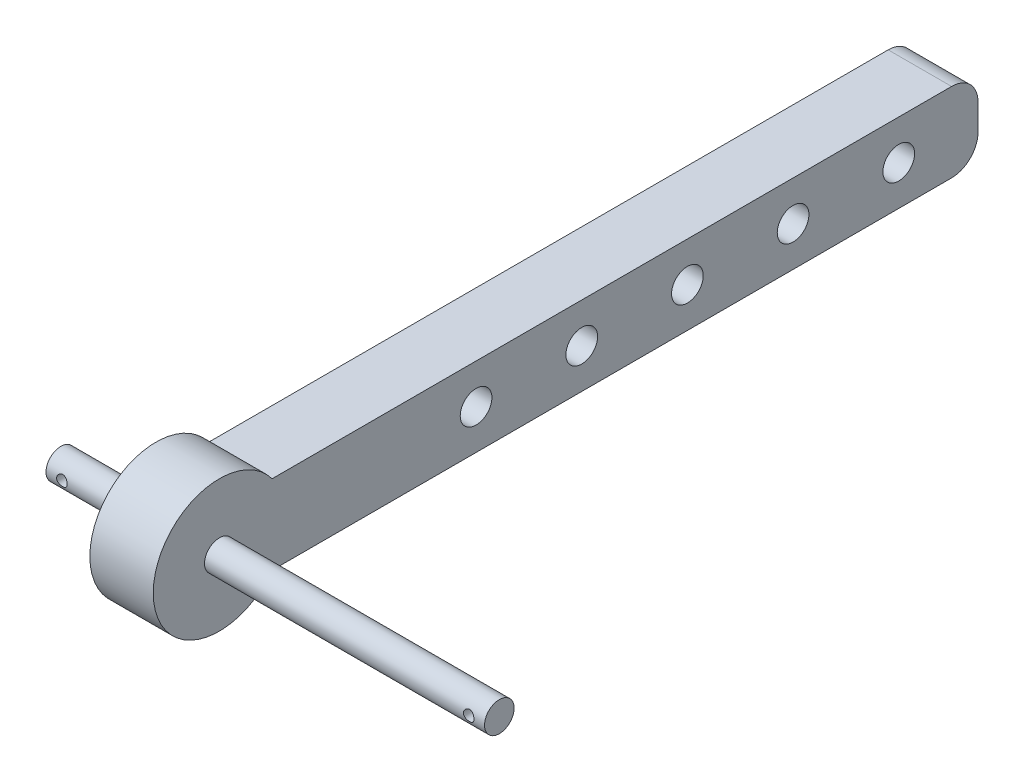
ISO-10303-21;
HEADER;
FILE_DESCRIPTION(('STEP AP214'),'2;1');
FILE_NAME('part.step','',(''),(''),'','','');
FILE_SCHEMA(('AUTOMOTIVE_DESIGN { 1 0 10303 214 1 1 1 1 }'));
ENDSEC;
DATA;
#1=APPLICATION_CONTEXT('core data for automotive mechanical design processes');
#2=APPLICATION_PROTOCOL_DEFINITION('international standard','automotive_design',2000,#1);
#3=PRODUCT_CONTEXT('',#1,'mechanical');
#4=PRODUCT('Part','Part','',(#3));
#5=PRODUCT_RELATED_PRODUCT_CATEGORY('part','',(#4));
#6=PRODUCT_DEFINITION_FORMATION('','',#4);
#7=PRODUCT_DEFINITION_CONTEXT('part definition',#1,'design');
#8=PRODUCT_DEFINITION('design','',#6,#7);
#9=PRODUCT_DEFINITION_SHAPE('','',#8);
#10=(LENGTH_UNIT() NAMED_UNIT(*) SI_UNIT(.MILLI.,.METRE.));
#11=(NAMED_UNIT(*) PLANE_ANGLE_UNIT() SI_UNIT($,.RADIAN.));
#12=(NAMED_UNIT(*) SI_UNIT($,.STERADIAN.) SOLID_ANGLE_UNIT());
#13=UNCERTAINTY_MEASURE_WITH_UNIT(LENGTH_MEASURE(1.E-05),#10,'distance_accuracy_value','');
#14=(GEOMETRIC_REPRESENTATION_CONTEXT(3) GLOBAL_UNCERTAINTY_ASSIGNED_CONTEXT((#13)) GLOBAL_UNIT_ASSIGNED_CONTEXT((#10,
#11,#12)) REPRESENTATION_CONTEXT('',''));
#15=CARTESIAN_POINT('',(0.,0.,0.));
#16=DIRECTION('',(0.,0.,1.));
#17=DIRECTION('',(1.,0.,0.));
#18=AXIS2_PLACEMENT_3D('',#15,#16,#17);
#19=CARTESIAN_POINT('',(12.,0.,0.));
#20=DIRECTION('',(0.,1.,0.));
#21=DIRECTION('',(0.,0.,1.));
#22=AXIS2_PLACEMENT_3D('',#19,#20,#21);
#23=PLANE('',#22);
#24=DIRECTION('',(0.,0.,-1.));
#25=VECTOR('',#24,1.);
#26=CARTESIAN_POINT('',(12.,0.,0.));
#27=LINE('',#26,#25);
#28=CARTESIAN_POINT('',(12.,0.,-16.4));
#29=VERTEX_POINT('',#28);
#30=CARTESIAN_POINT('',(12.,0.,-145.));
#31=VERTEX_POINT('',#30);
#32=EDGE_CURVE('E59',#29,#31,#27,.T.);
#33=ORIENTED_EDGE('',*,*,#32,.F.);
#34=DIRECTION('',(1.,0.,0.));
#35=VECTOR('',#34,1.);
#36=CARTESIAN_POINT('',(-35.3553390593274,0.,-16.4));
#37=LINE('',#36,#35);
#38=CARTESIAN_POINT('',(0.,0.,-16.4));
#39=VERTEX_POINT('',#38);
#40=EDGE_CURVE('E96',#29,#39,#37,.F.);
#41=ORIENTED_EDGE('',*,*,#40,.T.);
#42=DIRECTION('',(0.,0.,-1.));
#43=VECTOR('',#42,1.);
#44=CARTESIAN_POINT('',(0.,0.,0.));
#45=LINE('',#44,#43);
#46=CARTESIAN_POINT('',(0.,0.,-145.));
#47=VERTEX_POINT('',#46);
#48=EDGE_CURVE('E118',#39,#47,#45,.T.);
#49=ORIENTED_EDGE('',*,*,#48,.T.);
#50=DIRECTION('',(-1.,0.,0.));
#51=VECTOR('',#50,1.);
#52=CARTESIAN_POINT('',(12.,0.,-145.));
#53=LINE('',#52,#51);
#54=EDGE_CURVE('E131',#47,#31,#53,.F.);
#55=ORIENTED_EDGE('',*,*,#54,.T.);
#56=EDGE_LOOP('',(#33,#41,#49,#55));
#57=FACE_BOUND('',#56,.T.);
#58=ADVANCED_FACE('F37',(#57),#23,.F.);
#59=CARTESIAN_POINT('',(12.,0.,-150.));
#60=DIRECTION('',(0.,0.,1.));
#61=DIRECTION('',(1.,0.,0.));
#62=AXIS2_PLACEMENT_3D('',#59,#60,#61);
#63=PLANE('',#62);
#64=DIRECTION('',(0.,1.,0.));
#65=VECTOR('',#64,1.);
#66=CARTESIAN_POINT('',(12.,0.,-150.));
#67=LINE('',#66,#65);
#68=CARTESIAN_POINT('',(12.,5.,-150.));
#69=VERTEX_POINT('',#68);
#70=CARTESIAN_POINT('',(12.,10.,-150.));
#71=VERTEX_POINT('',#70);
#72=EDGE_CURVE('E111',#69,#71,#67,.T.);
#73=ORIENTED_EDGE('',*,*,#72,.F.);
#74=DIRECTION('',(-1.,0.,0.));
#75=VECTOR('',#74,1.);
#76=CARTESIAN_POINT('',(12.,5.,-150.));
#77=LINE('',#76,#75);
#78=CARTESIAN_POINT('',(0.,5.,-150.));
#79=VERTEX_POINT('',#78);
#80=EDGE_CURVE('E113',#69,#79,#77,.T.);
#81=ORIENTED_EDGE('',*,*,#80,.T.);
#82=DIRECTION('',(0.,1.,0.));
#83=VECTOR('',#82,1.);
#84=CARTESIAN_POINT('',(0.,0.,-150.));
#85=LINE('',#84,#83);
#86=CARTESIAN_POINT('',(0.,10.,-150.));
#87=VERTEX_POINT('',#86);
#88=EDGE_CURVE('E120',#79,#87,#85,.T.);
#89=ORIENTED_EDGE('',*,*,#88,.T.);
#90=DIRECTION('',(-1.,0.,0.));
#91=VECTOR('',#90,1.);
#92=CARTESIAN_POINT('',(12.,10.,-150.));
#93=LINE('',#92,#91);
#94=EDGE_CURVE('E110',#87,#71,#93,.F.);
#95=ORIENTED_EDGE('',*,*,#94,.T.);
#96=EDGE_LOOP('',(#73,#81,#89,#95));
#97=FACE_BOUND('',#96,.T.);
#98=ADVANCED_FACE('F151',(#97),#63,.F.);
#99=CARTESIAN_POINT('',(12.,15.,0.));
#100=DIRECTION('',(0.,-1.,0.));
#101=DIRECTION('',(0.,0.,-1.));
#102=AXIS2_PLACEMENT_3D('',#99,#100,#101);
#103=PLANE('',#102);
#104=DIRECTION('',(0.,0.,1.));
#105=VECTOR('',#104,1.);
#106=CARTESIAN_POINT('',(0.,15.,0.));
#107=LINE('',#106,#105);
#108=CARTESIAN_POINT('',(0.,15.,-145.));
#109=VERTEX_POINT('',#108);
#110=CARTESIAN_POINT('',(0.,15.,-16.4));
#111=VERTEX_POINT('',#110);
#112=EDGE_CURVE('E107',#109,#111,#107,.T.);
#113=ORIENTED_EDGE('',*,*,#112,.T.);
#114=DIRECTION('',(1.,0.,0.));
#115=VECTOR('',#114,1.);
#116=CARTESIAN_POINT('',(-35.3553390593274,15.,-16.4));
#117=LINE('',#116,#115);
#118=CARTESIAN_POINT('',(12.,15.,-16.4));
#119=VERTEX_POINT('',#118);
#120=EDGE_CURVE('E93',#111,#119,#117,.T.);
#121=ORIENTED_EDGE('',*,*,#120,.T.);
#122=DIRECTION('',(0.,0.,1.));
#123=VECTOR('',#122,1.);
#124=CARTESIAN_POINT('',(12.,15.,0.));
#125=LINE('',#124,#123);
#126=CARTESIAN_POINT('',(12.,15.,-145.));
#127=VERTEX_POINT('',#126);
#128=EDGE_CURVE('E104',#127,#119,#125,.T.);
#129=ORIENTED_EDGE('',*,*,#128,.F.);
#130=DIRECTION('',(-1.,0.,0.));
#131=VECTOR('',#130,1.);
#132=CARTESIAN_POINT('',(12.,15.,-145.));
#133=LINE('',#132,#131);
#134=EDGE_CURVE('E45',#127,#109,#133,.T.);
#135=ORIENTED_EDGE('',*,*,#134,.T.);
#136=EDGE_LOOP('',(#113,#121,#129,#135));
#137=FACE_BOUND('',#136,.T.);
#138=ADVANCED_FACE('F102',(#137),#103,.F.);
#139=CARTESIAN_POINT('',(12.,0.,0.));
#140=DIRECTION('',(-1.,0.,0.));
#141=DIRECTION('',(0.,0.,1.));
#142=AXIS2_PLACEMENT_3D('',#139,#140,#141);
#143=PLANE('',#142);
#144=CARTESIAN_POINT('',(12.,7.5,-135.));
#145=DIRECTION('',(-1.,0.,0.));
#146=DIRECTION('',(0.,0.,1.));
#147=AXIS2_PLACEMENT_3D('',#144,#145,#146);
#148=CIRCLE('',#147,2.99999999999999);
#149=CARTESIAN_POINT('',(12.,7.5,-132.));
#150=VERTEX_POINT('',#149);
#151=EDGE_CURVE('E231',#150,#150,#148,.F.);
#152=ORIENTED_EDGE('',*,*,#151,.F.);
#153=EDGE_LOOP('',(#152));
#154=FACE_BOUND('',#153,.T.);
#155=CARTESIAN_POINT('',(12.,7.5,-115.));
#156=DIRECTION('',(-1.,0.,0.));
#157=DIRECTION('',(0.,0.,1.));
#158=AXIS2_PLACEMENT_3D('',#155,#156,#157);
#159=CIRCLE('',#158,3.00000000000001);
#160=CARTESIAN_POINT('',(12.,7.5,-112.));
#161=VERTEX_POINT('',#160);
#162=EDGE_CURVE('E238',#161,#161,#159,.F.);
#163=ORIENTED_EDGE('',*,*,#162,.F.);
#164=EDGE_LOOP('',(#163));
#165=FACE_BOUND('',#164,.T.);
#166=CARTESIAN_POINT('',(12.,7.5,-95.));
#167=DIRECTION('',(-1.,0.,0.));
#168=DIRECTION('',(0.,0.,1.));
#169=AXIS2_PLACEMENT_3D('',#166,#167,#168);
#170=CIRCLE('',#169,3.00000000000001);
#171=CARTESIAN_POINT('',(12.,7.5,-92.));
#172=VERTEX_POINT('',#171);
#173=EDGE_CURVE('E244',#172,#172,#170,.F.);
#174=ORIENTED_EDGE('',*,*,#173,.F.);
#175=EDGE_LOOP('',(#174));
#176=FACE_BOUND('',#175,.T.);
#177=CARTESIAN_POINT('',(12.,7.5,-75.));
#178=DIRECTION('',(-1.,0.,0.));
#179=DIRECTION('',(0.,0.,1.));
#180=AXIS2_PLACEMENT_3D('',#177,#178,#179);
#181=CIRCLE('',#180,3.00000000000001);
#182=CARTESIAN_POINT('',(12.,7.5,-72.));
#183=VERTEX_POINT('',#182);
#184=EDGE_CURVE('E250',#183,#183,#181,.F.);
#185=ORIENTED_EDGE('',*,*,#184,.F.);
#186=EDGE_LOOP('',(#185));
#187=FACE_BOUND('',#186,.T.);
#188=CARTESIAN_POINT('',(12.,7.5,-55.));
#189=DIRECTION('',(-1.,0.,0.));
#190=DIRECTION('',(0.,0.,1.));
#191=AXIS2_PLACEMENT_3D('',#188,#189,#190);
#192=CIRCLE('',#191,3.);
#193=CARTESIAN_POINT('',(12.,7.5,-52.));
#194=VERTEX_POINT('',#193);
#195=EDGE_CURVE('E256',#194,#194,#192,.F.);
#196=ORIENTED_EDGE('',*,*,#195,.F.);
#197=EDGE_LOOP('',(#196));
#198=FACE_BOUND('',#197,.T.);
#199=CARTESIAN_POINT('',(12.,7.5,-6.4));
#200=DIRECTION('',(-1.,0.,0.));
#201=DIRECTION('',(0.,0.,1.));
#202=AXIS2_PLACEMENT_3D('',#199,#200,#201);
#203=CIRCLE('',#202,2.8);
#204=CARTESIAN_POINT('',(12.,7.5,-3.6));
#205=VERTEX_POINT('',#204);
#206=EDGE_CURVE('E98',#205,#205,#203,.T.);
#207=ORIENTED_EDGE('',*,*,#206,.T.);
#208=EDGE_LOOP('',(#207));
#209=FACE_BOUND('',#208,.T.);
#210=CARTESIAN_POINT('',(12.,7.5,-6.4));
#211=DIRECTION('',(1.,0.,0.));
#212=DIRECTION('',(0.,0.,-1.));
#213=AXIS2_PLACEMENT_3D('',#210,#211,#212);
#214=CIRCLE('',#213,12.5);
#215=EDGE_CURVE('E90',#119,#29,#214,.T.);
#216=ORIENTED_EDGE('',*,*,#215,.T.);
#217=ORIENTED_EDGE('',*,*,#32,.T.);
#218=CARTESIAN_POINT('',(12.,5.,-145.));
#219=DIRECTION('',(-1.,0.,0.));
#220=DIRECTION('',(0.,0.,1.));
#221=AXIS2_PLACEMENT_3D('',#218,#219,#220);
#222=CIRCLE('',#221,5.);
#223=EDGE_CURVE('E134',#31,#69,#222,.F.);
#224=ORIENTED_EDGE('',*,*,#223,.T.);
#225=ORIENTED_EDGE('',*,*,#72,.T.);
#226=CARTESIAN_POINT('',(12.,10.,-145.));
#227=DIRECTION('',(-1.,0.,0.));
#228=DIRECTION('',(0.,0.,1.));
#229=AXIS2_PLACEMENT_3D('',#226,#227,#228);
#230=CIRCLE('',#229,5.);
#231=EDGE_CURVE('E52',#71,#127,#230,.F.);
#232=ORIENTED_EDGE('',*,*,#231,.T.);
#233=ORIENTED_EDGE('',*,*,#128,.T.);
#234=EDGE_LOOP('',(#216,#217,#224,#225,#232,#233));
#235=FACE_BOUND('',#234,.T.);
#236=ADVANCED_FACE('F109',(#154,#165,#176,#187,#198,#209,#235),#143,.F.);
#237=CARTESIAN_POINT('',(0.,0.,0.));
#238=DIRECTION('',(-1.,0.,0.));
#239=DIRECTION('',(0.,0.,1.));
#240=AXIS2_PLACEMENT_3D('',#237,#238,#239);
#241=PLANE('',#240);
#242=CARTESIAN_POINT('',(0.,7.5,-135.));
#243=DIRECTION('',(-1.,0.,0.));
#244=DIRECTION('',(0.,0.,1.));
#245=AXIS2_PLACEMENT_3D('',#242,#243,#244);
#246=CIRCLE('',#245,2.99999999999999);
#247=CARTESIAN_POINT('',(0.,7.5,-132.));
#248=VERTEX_POINT('',#247);
#249=EDGE_CURVE('E233',#248,#248,#246,.T.);
#250=ORIENTED_EDGE('',*,*,#249,.F.);
#251=EDGE_LOOP('',(#250));
#252=FACE_BOUND('',#251,.T.);
#253=CARTESIAN_POINT('',(0.,7.5,-115.));
#254=DIRECTION('',(-1.,0.,0.));
#255=DIRECTION('',(0.,0.,1.));
#256=AXIS2_PLACEMENT_3D('',#253,#254,#255);
#257=CIRCLE('',#256,3.00000000000001);
#258=CARTESIAN_POINT('',(0.,7.5,-112.));
#259=VERTEX_POINT('',#258);
#260=EDGE_CURVE('E241',#259,#259,#257,.T.);
#261=ORIENTED_EDGE('',*,*,#260,.F.);
#262=EDGE_LOOP('',(#261));
#263=FACE_BOUND('',#262,.T.);
#264=CARTESIAN_POINT('',(0.,7.5,-95.));
#265=DIRECTION('',(-1.,0.,0.));
#266=DIRECTION('',(0.,0.,1.));
#267=AXIS2_PLACEMENT_3D('',#264,#265,#266);
#268=CIRCLE('',#267,3.00000000000001);
#269=CARTESIAN_POINT('',(0.,7.5,-92.));
#270=VERTEX_POINT('',#269);
#271=EDGE_CURVE('E247',#270,#270,#268,.T.);
#272=ORIENTED_EDGE('',*,*,#271,.F.);
#273=EDGE_LOOP('',(#272));
#274=FACE_BOUND('',#273,.T.);
#275=CARTESIAN_POINT('',(0.,7.5,-75.));
#276=DIRECTION('',(-1.,0.,0.));
#277=DIRECTION('',(0.,0.,1.));
#278=AXIS2_PLACEMENT_3D('',#275,#276,#277);
#279=CIRCLE('',#278,3.00000000000001);
#280=CARTESIAN_POINT('',(0.,7.5,-72.));
#281=VERTEX_POINT('',#280);
#282=EDGE_CURVE('E253',#281,#281,#279,.T.);
#283=ORIENTED_EDGE('',*,*,#282,.F.);
#284=EDGE_LOOP('',(#283));
#285=FACE_BOUND('',#284,.T.);
#286=CARTESIAN_POINT('',(0.,7.5,-55.));
#287=DIRECTION('',(-1.,0.,0.));
#288=DIRECTION('',(0.,0.,1.));
#289=AXIS2_PLACEMENT_3D('',#286,#287,#288);
#290=CIRCLE('',#289,3.);
#291=CARTESIAN_POINT('',(0.,7.5,-52.));
#292=VERTEX_POINT('',#291);
#293=EDGE_CURVE('E259',#292,#292,#290,.T.);
#294=ORIENTED_EDGE('',*,*,#293,.F.);
#295=EDGE_LOOP('',(#294));
#296=FACE_BOUND('',#295,.T.);
#297=CARTESIAN_POINT('',(0.,7.5,-6.4));
#298=DIRECTION('',(-1.,0.,0.));
#299=DIRECTION('',(0.,0.,1.));
#300=AXIS2_PLACEMENT_3D('',#297,#298,#299);
#301=CIRCLE('',#300,2.8);
#302=CARTESIAN_POINT('',(0.,7.5,-3.6));
#303=VERTEX_POINT('',#302);
#304=EDGE_CURVE('E11',#303,#303,#301,.T.);
#305=ORIENTED_EDGE('',*,*,#304,.F.);
#306=EDGE_LOOP('',(#305));
#307=FACE_BOUND('',#306,.T.);
#308=ORIENTED_EDGE('',*,*,#48,.F.);
#309=CARTESIAN_POINT('',(0.,7.5,-6.4));
#310=DIRECTION('',(-1.,0.,0.));
#311=DIRECTION('',(0.,0.,1.));
#312=AXIS2_PLACEMENT_3D('',#309,#310,#311);
#313=CIRCLE('',#312,12.5);
#314=EDGE_CURVE('E97',#111,#39,#313,.F.);
#315=ORIENTED_EDGE('',*,*,#314,.F.);
#316=ORIENTED_EDGE('',*,*,#112,.F.);
#317=CARTESIAN_POINT('',(0.,10.,-145.));
#318=DIRECTION('',(-1.,0.,0.));
#319=DIRECTION('',(0.,0.,1.));
#320=AXIS2_PLACEMENT_3D('',#317,#318,#319);
#321=CIRCLE('',#320,5.);
#322=EDGE_CURVE('E126',#109,#87,#321,.T.);
#323=ORIENTED_EDGE('',*,*,#322,.T.);
#324=ORIENTED_EDGE('',*,*,#88,.F.);
#325=CARTESIAN_POINT('',(0.,5.,-145.));
#326=DIRECTION('',(-1.,0.,0.));
#327=DIRECTION('',(0.,0.,1.));
#328=AXIS2_PLACEMENT_3D('',#325,#326,#327);
#329=CIRCLE('',#328,5.);
#330=EDGE_CURVE('E128',#79,#47,#329,.T.);
#331=ORIENTED_EDGE('',*,*,#330,.T.);
#332=EDGE_LOOP('',(#308,#315,#316,#323,#324,#331));
#333=FACE_BOUND('',#332,.T.);
#334=ADVANCED_FACE('F138',(#252,#263,#274,#285,#296,#307,#333),#241,.T.);
#335=CARTESIAN_POINT('',(12.,5.,-145.));
#336=DIRECTION('',(-1.,0.,0.));
#337=DIRECTION('',(0.,0.,1.));
#338=AXIS2_PLACEMENT_3D('',#335,#336,#337);
#339=CYLINDRICAL_SURFACE('',#338,5.);
#340=ORIENTED_EDGE('',*,*,#223,.F.);
#341=ORIENTED_EDGE('',*,*,#54,.F.);
#342=ORIENTED_EDGE('',*,*,#330,.F.);
#343=ORIENTED_EDGE('',*,*,#80,.F.);
#344=EDGE_LOOP('',(#340,#341,#342,#343));
#345=FACE_BOUND('',#344,.T.);
#346=ADVANCED_FACE('F148',(#345),#339,.T.);
#347=CARTESIAN_POINT('',(12.,10.,-145.));
#348=DIRECTION('',(-1.,0.,0.));
#349=DIRECTION('',(0.,0.,1.));
#350=AXIS2_PLACEMENT_3D('',#347,#348,#349);
#351=CYLINDRICAL_SURFACE('',#350,5.);
#352=ORIENTED_EDGE('',*,*,#231,.F.);
#353=ORIENTED_EDGE('',*,*,#94,.F.);
#354=ORIENTED_EDGE('',*,*,#322,.F.);
#355=ORIENTED_EDGE('',*,*,#134,.F.);
#356=EDGE_LOOP('',(#352,#353,#354,#355));
#357=FACE_BOUND('',#356,.T.);
#358=ADVANCED_FACE('F39',(#357),#351,.T.);
#359=CARTESIAN_POINT('',(-35.3553390593274,7.5,-6.4));
#360=DIRECTION('',(1.,0.,0.));
#361=DIRECTION('',(0.,0.,-1.));
#362=AXIS2_PLACEMENT_3D('',#359,#360,#361);
#363=CYLINDRICAL_SURFACE('',#362,12.5);
#364=ORIENTED_EDGE('',*,*,#40,.F.);
#365=ORIENTED_EDGE('',*,*,#215,.F.);
#366=ORIENTED_EDGE('',*,*,#120,.F.);
#367=ORIENTED_EDGE('',*,*,#314,.T.);
#368=EDGE_LOOP('',(#364,#365,#366,#367));
#369=FACE_BOUND('',#368,.T.);
#370=ADVANCED_FACE('F92',(#369),#363,.T.);
#371=CARTESIAN_POINT('',(-18.,7.5,-6.4));
#372=DIRECTION('',(-1.,0.,0.));
#373=DIRECTION('',(0.,0.,1.));
#374=AXIS2_PLACEMENT_3D('',#371,#372,#373);
#375=PLANE('',#374);
#376=CARTESIAN_POINT('',(-18.,7.5,-6.4));
#377=DIRECTION('',(-1.,0.,0.));
#378=DIRECTION('',(0.,0.,1.));
#379=AXIS2_PLACEMENT_3D('',#376,#377,#378);
#380=CIRCLE('',#379,2.8);
#381=CARTESIAN_POINT('',(-18.,7.5,-3.6));
#382=VERTEX_POINT('',#381);
#383=EDGE_CURVE('E210',#382,#382,#380,.T.);
#384=ORIENTED_EDGE('',*,*,#383,.T.);
#385=EDGE_LOOP('',(#384));
#386=FACE_BOUND('',#385,.T.);
#387=ADVANCED_FACE('F158',(#386),#375,.T.);
#388=CARTESIAN_POINT('',(65.,7.5,-6.4));
#389=DIRECTION('',(-1.,0.,0.));
#390=DIRECTION('',(0.,0.,1.));
#391=AXIS2_PLACEMENT_3D('',#388,#389,#390);
#392=CYLINDRICAL_SURFACE('',#391,2.8);
#393=CARTESIAN_POINT('',(-14.,7.49999999999999,-3.59999999999999));
#394=CARTESIAN_POINT('',(-13.9999988703833,7.4456640957925,-3.59999918818819));
#395=CARTESIAN_POINT('',(-14.0044427028931,7.39133622802098,-3.6015957735854));
#396=CARTESIAN_POINT('',(-14.0220365148768,7.28429404135723,-3.60780638020554));
#397=CARTESIAN_POINT('',(-14.0351861620259,7.23157966095414,-3.61242028624901));
#398=CARTESIAN_POINT('',(-14.069674056507,7.12932315333026,-3.62416756075608));
#399=CARTESIAN_POINT('',(-14.090997423888,7.07977545141631,-3.63129634910262));
#400=CARTESIAN_POINT('',(-14.141155487747,6.98496165880639,-3.64735568787059));
#401=CARTESIAN_POINT('',(-14.1699919837796,6.93969659743969,-3.65628666984009));
#402=CARTESIAN_POINT('',(-14.2355372528466,6.8529647887786,-3.67541049028099));
#403=CARTESIAN_POINT('',(-14.2724874924021,6.81168793730858,-3.68563669021972));
#404=CARTESIAN_POINT('',(-14.3526985455159,6.73576720271027,-3.70602590985494));
#405=CARTESIAN_POINT('',(-14.3959610334866,6.70112508519461,-3.71618891203923));
#406=CARTESIAN_POINT('',(-14.4893591171103,6.63830505775262,-3.73567971932413));
#407=CARTESIAN_POINT('',(-14.5396778974066,6.61038588082067,-3.74496756895283));
#408=CARTESIAN_POINT('',(-14.6446814658817,6.56348971107998,-3.76114259019398));
#409=CARTESIAN_POINT('',(-14.6993646858271,6.54450952307381,-3.76803061938094));
#410=CARTESIAN_POINT('',(-14.809369134481,6.51676347820588,-3.77827184711178));
#411=CARTESIAN_POINT('',(-14.8645877227772,6.50763792237066,-3.781749066484));
#412=CARTESIAN_POINT('',(-14.9758734527295,6.49873539109007,-3.78513975248078));
#413=CARTESIAN_POINT('',(-15.0319402770166,6.49895500157609,-3.78505452057549));
#414=CARTESIAN_POINT('',(-15.140142262021,6.50845968411067,-3.78143764681123));
#415=CARTESIAN_POINT('',(-15.1923273411999,6.5172593529454,-3.77809054532385));
#416=CARTESIAN_POINT('',(-15.2944246108733,6.54287659577975,-3.76863167130248));
#417=CARTESIAN_POINT('',(-15.3443364898603,6.55969526506153,-3.76251952110774));
#418=CARTESIAN_POINT('',(-15.4415094983143,6.60116173262359,-3.74809931804875));
#419=CARTESIAN_POINT('',(-15.4887078410634,6.62594321626696,-3.73975420889984));
#420=CARTESIAN_POINT('',(-15.5784225546599,6.68253890923721,-3.72182212121453));
#421=CARTESIAN_POINT('',(-15.620937413323,6.71435538007906,-3.71223474374132));
#422=CARTESIAN_POINT('',(-15.7027838365485,6.78638740381156,-3.69219000613643));
#423=CARTESIAN_POINT('',(-15.7417671436997,6.82699467393824,-3.6817151061026));
#424=CARTESIAN_POINT('',(-15.8124686731339,6.91429526186033,-3.66157810557794));
#425=CARTESIAN_POINT('',(-15.8441859769195,6.96098934792251,-3.65191610794389));
#426=CARTESIAN_POINT('',(-15.8997922439757,7.05995986283129,-3.634332005112));
#427=CARTESIAN_POINT('',(-15.9235752959559,7.1123003550299,-3.62643387131835));
#428=CARTESIAN_POINT('',(-15.9618863296641,7.22059061274909,-3.61344332925058));
#429=CARTESIAN_POINT('',(-15.9764180243051,7.27653892037848,-3.60834979549747));
#430=CARTESIAN_POINT('',(-15.9951676602638,7.38751796327446,-3.60173518947146));
#431=CARTESIAN_POINT('',(-15.9998552522983,7.44245975473235,-3.60005158400363));
#432=CARTESIAN_POINT('',(-16.0001380487961,7.55236374862935,-3.59995080843714));
#433=CARTESIAN_POINT('',(-15.9957350507967,7.60732594488506,-3.60153299257417));
#434=CARTESIAN_POINT('',(-15.9783255450714,7.7137474795991,-3.60767860001904));
#435=CARTESIAN_POINT('',(-15.9656180976807,7.76526233923255,-3.61213832872232));
#436=CARTESIAN_POINT('',(-15.9323453621056,7.86539977761199,-3.62348701681329));
#437=CARTESIAN_POINT('',(-15.9117790536686,7.91402197988006,-3.63037629160036));
#438=CARTESIAN_POINT('',(-15.8627364586394,8.00852716340599,-3.64613704170669));
#439=CARTESIAN_POINT('',(-15.8340534078003,8.05429418519488,-3.65505895015071));
#440=CARTESIAN_POINT('',(-15.769829001957,8.14051174758947,-3.6738864179448));
#441=CARTESIAN_POINT('',(-15.7342852940905,8.18096045625582,-3.68379231418619));
#442=CARTESIAN_POINT('',(-15.6551481469084,8.257609168239,-3.70413583615819));
#443=CARTESIAN_POINT('',(-15.6112301147921,8.29347472762787,-3.71457408053481));
#444=CARTESIAN_POINT('',(-15.5177834919983,8.35738210312638,-3.73428849600916));
#445=CARTESIAN_POINT('',(-15.4682546275486,8.38542353723821,-3.74356461035595));
#446=CARTESIAN_POINT('',(-15.3647740763056,8.43283474437684,-3.75983866817357));
#447=CARTESIAN_POINT('',(-15.3108177317961,8.45219524302415,-3.76683417296182));
#448=CARTESIAN_POINT('',(-15.200095959712,8.48144567606698,-3.77759423198303));
#449=CARTESIAN_POINT('',(-15.1433320717351,8.49134074185511,-3.78136053671229));
#450=CARTESIAN_POINT('',(-15.0321918082508,8.50094502202744,-3.78501761428866));
#451=CARTESIAN_POINT('',(-14.9778707142302,8.50121770791272,-3.78512277297401));
#452=CARTESIAN_POINT('',(-14.870000931738,8.49298814003547,-3.78198672214491));
#453=CARTESIAN_POINT('',(-14.8164521835007,8.48448656897682,-3.77874577298309));
#454=CARTESIAN_POINT('',(-14.7129997658513,8.45937203042877,-3.76945319828886));
#455=CARTESIAN_POINT('',(-14.6630383603977,8.44296784403573,-3.76347410300402));
#456=CARTESIAN_POINT('',(-14.5665429272532,8.40269057735268,-3.74941468273952));
#457=CARTESIAN_POINT('',(-14.5200097276223,8.37881569982757,-3.74133385222141));
#458=CARTESIAN_POINT('',(-14.4292297000191,8.32292125228761,-3.72349107602067));
#459=CARTESIAN_POINT('',(-14.3852047836548,8.29056148638068,-3.71366639865255));
#460=CARTESIAN_POINT('',(-14.3030289981358,8.21916345204769,-3.69367835468673));
#461=CARTESIAN_POINT('',(-14.2648799118596,8.18012316413432,-3.68351488642456));
#462=CARTESIAN_POINT('',(-14.1937112388734,8.09426500935809,-3.66341821732918));
#463=CARTESIAN_POINT('',(-14.1610187840836,8.04716700246681,-3.65351853171694));
#464=CARTESIAN_POINT('',(-14.1040369344648,7.94780452499785,-3.63558030239262));
#465=CARTESIAN_POINT('',(-14.0797469039189,7.89554044566356,-3.62754161789475));
#466=CARTESIAN_POINT('',(-14.0403438758766,7.78705853460998,-3.61421597527667));
#467=CARTESIAN_POINT('',(-14.0252698367349,7.7308250241871,-3.60894071210442));
#468=CARTESIAN_POINT('',(-14.0051004501445,7.61639075245392,-3.60183383088963));
#469=CARTESIAN_POINT('',(-14.0000012097575,7.55819076763912,-3.60000086940582));
#470=CARTESIAN_POINT('',(-14.,7.49999999999999,-3.59999999999999));
#471=B_SPLINE_CURVE_WITH_KNOTS('',3,(#393,#394,#395,#396,#397,#398,#399,#400,#401,#402,#403,
#404,#405,#406,#407,#408,#409,#410,#411,#412,#413,#414,#415,#416,#417,#418,#419,#420,#421,#422,
#423,#424,#425,#426,#427,#428,#429,#430,#431,#432,#433,#434,#435,#436,#437,#438,#439,#440,#441,
#442,#443,#444,#445,#446,#447,#448,#449,#450,#451,#452,#453,#454,#455,#456,#457,#458,#459,#460,
#461,#462,#463,#464,#465,#466,#467,#468,#469,#470),.UNSPECIFIED.,.T.,.F.,(4,2,2,2,2,2,2,2,2,2,2,
2,2,2,2,2,2,2,2,2,2,2,2,2,2,2,2,2,2,2,2,2,2,2,2,2,2,2,4),(0.,0.162793286857182,
0.325580359807973,0.488072481702516,0.650603559761992,0.818858289838084,0.987157733259749,
1.16115842712134,1.3350968780014,1.5024462495149,1.66973448382581,1.82807698599179,
1.98644112170462,2.14761659867788,2.30884396374347,2.47982661254055,2.65083086338855,
2.82403409905451,2.9971677779423,3.16183411964833,3.32646790400331,3.48547730721131,
3.64450736034317,3.80802342781249,3.97159567307726,4.14375353855409,4.31591980783636,
4.48826957725229,4.66052585951367,4.82267723829236,4.98481600141228,5.14288832945606,
5.30099871446504,5.46681378100981,5.63267906142988,5.8063737431397,5.98005528045261,
6.15446602731655,6.32880869202204),.UNSPECIFIED.);
#472=CARTESIAN_POINT('',(-14.,7.49999999999999,-3.59999999999999));
#473=VERTEX_POINT('',#472);
#474=EDGE_CURVE('E209',#473,#473,#471,.T.);
#475=ORIENTED_EDGE('',*,*,#474,.T.);
#476=EDGE_LOOP('',(#475));
#477=FACE_BOUND('',#476,.T.);
#478=CARTESIAN_POINT('',(-14.,7.49999999999999,-9.19999999999999));
#479=CARTESIAN_POINT('',(-13.9999988703833,7.55433590420748,-9.20000081181179));
#480=CARTESIAN_POINT('',(-14.0044427028931,7.608663771979,-9.1984042264146));
#481=CARTESIAN_POINT('',(-14.0220365148768,7.71570595864275,-9.19219361979447));
#482=CARTESIAN_POINT('',(-14.0351861620259,7.76842033904584,-9.187579713751));
#483=CARTESIAN_POINT('',(-14.069674056507,7.87067684666972,-9.17583243924392));
#484=CARTESIAN_POINT('',(-14.090997423888,7.92022454858367,-9.16870365089739));
#485=CARTESIAN_POINT('',(-14.141155487747,8.0150383411936,-9.15264431212942));
#486=CARTESIAN_POINT('',(-14.1699919837796,8.06030340256029,-9.14371333015992));
#487=CARTESIAN_POINT('',(-14.2355372528466,8.14703521122138,-9.12458950971902));
#488=CARTESIAN_POINT('',(-14.2724874924021,8.1883120626914,-9.11436330978029));
#489=CARTESIAN_POINT('',(-14.3526985455159,8.26423279728971,-9.09397409014506));
#490=CARTESIAN_POINT('',(-14.3959610334866,8.29887491480538,-9.08381108796078));
#491=CARTESIAN_POINT('',(-14.4893591171103,8.36169494224736,-9.06432028067589));
#492=CARTESIAN_POINT('',(-14.5396778974066,8.38961411917931,-9.05503243104718));
#493=CARTESIAN_POINT('',(-14.6446814658817,8.43651028892,-9.03885740980603));
#494=CARTESIAN_POINT('',(-14.6993646858271,8.45549047692618,-9.03196938061907));
#495=CARTESIAN_POINT('',(-14.809369134481,8.4832365217941,-9.02172815288823));
#496=CARTESIAN_POINT('',(-14.8645877227772,8.49236207762932,-9.01825093351601));
#497=CARTESIAN_POINT('',(-14.9758734527295,8.50126460890991,-9.01486024751923));
#498=CARTESIAN_POINT('',(-15.0319402770166,8.50104499842389,-9.01494547942452));
#499=CARTESIAN_POINT('',(-15.140142262021,8.49154031588931,-9.01856235318878));
#500=CARTESIAN_POINT('',(-15.1923273411999,8.48274064705458,-9.02190945467616));
#501=CARTESIAN_POINT('',(-15.2944246108733,8.45712340422023,-9.03136832869754));
#502=CARTESIAN_POINT('',(-15.3443364898603,8.44030473493845,-9.03748047889228));
#503=CARTESIAN_POINT('',(-15.4415094983143,8.39883826737639,-9.05190068195126));
#504=CARTESIAN_POINT('',(-15.4887078410634,8.37405678373302,-9.06024579110017));
#505=CARTESIAN_POINT('',(-15.5784225546599,8.31746109076277,-9.07817787878548));
#506=CARTESIAN_POINT('',(-15.620937413323,8.28564461992092,-9.08776525625869));
#507=CARTESIAN_POINT('',(-15.7027838365485,8.21361259618842,-9.10780999386358));
#508=CARTESIAN_POINT('',(-15.7417671436997,8.17300532606174,-9.11828489389741));
#509=CARTESIAN_POINT('',(-15.8124686731339,8.08570473813965,-9.13842189442206));
#510=CARTESIAN_POINT('',(-15.8441859769195,8.03901065207747,-9.14808389205611));
#511=CARTESIAN_POINT('',(-15.8997922439757,7.94004013716869,-9.16566799488801));
#512=CARTESIAN_POINT('',(-15.9235752959559,7.88769964497008,-9.17356612868166));
#513=CARTESIAN_POINT('',(-15.9618863296641,7.77940938725089,-9.18655667074942));
#514=CARTESIAN_POINT('',(-15.9764180243051,7.7234610796215,-9.19165020450254));
#515=CARTESIAN_POINT('',(-15.9951676602638,7.61248203672552,-9.19826481052855));
#516=CARTESIAN_POINT('',(-15.9998552522983,7.55754024526763,-9.19994841599638));
#517=CARTESIAN_POINT('',(-16.0001380487961,7.44763625137063,-9.20004919156287));
#518=CARTESIAN_POINT('',(-15.9957350507967,7.39267405511492,-9.19846700742583));
#519=CARTESIAN_POINT('',(-15.9783255450714,7.28625252040088,-9.19232139998096));
#520=CARTESIAN_POINT('',(-15.9656180976807,7.23473766076743,-9.18786167127768));
#521=CARTESIAN_POINT('',(-15.9323453621056,7.13460022238799,-9.17651298318671));
#522=CARTESIAN_POINT('',(-15.9117790536686,7.08597802011992,-9.16962370839964));
#523=CARTESIAN_POINT('',(-15.8627364586394,6.99147283659399,-9.15386295829331));
#524=CARTESIAN_POINT('',(-15.8340534078003,6.9457058148051,-9.1449410498493));
#525=CARTESIAN_POINT('',(-15.769829001957,6.85948825241051,-9.1261135820552));
#526=CARTESIAN_POINT('',(-15.7342852940905,6.81903954374416,-9.11620768581381));
#527=CARTESIAN_POINT('',(-15.6551481469084,6.74239083176098,-9.09586416384181));
#528=CARTESIAN_POINT('',(-15.6112301147921,6.70652527237211,-9.08542591946519));
#529=CARTESIAN_POINT('',(-15.5177834919983,6.6426178968736,-9.06571150399084));
#530=CARTESIAN_POINT('',(-15.4682546275486,6.61457646276177,-9.05643538964405));
#531=CARTESIAN_POINT('',(-15.3647740763056,6.56716525562314,-9.04016133182642));
#532=CARTESIAN_POINT('',(-15.3108177317961,6.54780475697583,-9.03316582703817));
#533=CARTESIAN_POINT('',(-15.200095959712,6.518554323933,-9.02240576801696));
#534=CARTESIAN_POINT('',(-15.1433320717351,6.50865925814487,-9.01863946328771));
#535=CARTESIAN_POINT('',(-15.0321918082508,6.49905497797254,-9.01498238571133));
#536=CARTESIAN_POINT('',(-14.9778707142302,6.49878229208726,-9.01487722702599));
#537=CARTESIAN_POINT('',(-14.870000931738,6.50701185996451,-9.01801327785509));
#538=CARTESIAN_POINT('',(-14.8164521835007,6.51551343102316,-9.02125422701691));
#539=CARTESIAN_POINT('',(-14.7129997658513,6.54062796957122,-9.03054680171114));
#540=CARTESIAN_POINT('',(-14.6630383603977,6.55703215596425,-9.03652589699598));
#541=CARTESIAN_POINT('',(-14.5665429272532,6.59730942264731,-9.05058531726047));
#542=CARTESIAN_POINT('',(-14.5200097276223,6.62118430017241,-9.05866614777859));
#543=CARTESIAN_POINT('',(-14.4292297000191,6.67707874771237,-9.07650892397933));
#544=CARTESIAN_POINT('',(-14.3852047836548,6.7094385136193,-9.08633360134745));
#545=CARTESIAN_POINT('',(-14.3030289981358,6.78083654795229,-9.10632164531327));
#546=CARTESIAN_POINT('',(-14.2648799118596,6.81987683586566,-9.11648511357544));
#547=CARTESIAN_POINT('',(-14.1937112388734,6.90573499064189,-9.13658178267082));
#548=CARTESIAN_POINT('',(-14.1610187840836,6.95283299753317,-9.14648146828306));
#549=CARTESIAN_POINT('',(-14.1040369344648,7.05219547500213,-9.16441969760738));
#550=CARTESIAN_POINT('',(-14.0797469039189,7.10445955433641,-9.17245838210525));
#551=CARTESIAN_POINT('',(-14.0403438758766,7.21294146539,-9.18578402472333));
#552=CARTESIAN_POINT('',(-14.0252698367349,7.26917497581288,-9.19105928789559));
#553=CARTESIAN_POINT('',(-14.0051004501445,7.38360924754606,-9.19816616911036));
#554=CARTESIAN_POINT('',(-14.0000012097575,7.44180923236086,-9.19999913059416));
#555=CARTESIAN_POINT('',(-14.,7.49999999999999,-9.19999999999999));
#556=B_SPLINE_CURVE_WITH_KNOTS('',3,(#478,#479,#480,#481,#482,#483,#484,#485,#486,#487,#488,
#489,#490,#491,#492,#493,#494,#495,#496,#497,#498,#499,#500,#501,#502,#503,#504,#505,#506,#507,
#508,#509,#510,#511,#512,#513,#514,#515,#516,#517,#518,#519,#520,#521,#522,#523,#524,#525,#526,
#527,#528,#529,#530,#531,#532,#533,#534,#535,#536,#537,#538,#539,#540,#541,#542,#543,#544,#545,
#546,#547,#548,#549,#550,#551,#552,#553,#554,#555),.UNSPECIFIED.,.T.,.F.,(4,2,2,2,2,2,2,2,2,2,2,
2,2,2,2,2,2,2,2,2,2,2,2,2,2,2,2,2,2,2,2,2,2,2,2,2,2,2,4),(0.,0.162793286857182,
0.325580359807973,0.488072481702516,0.650603559761992,0.818858289838084,0.987157733259748,
1.16115842712134,1.3350968780014,1.5024462495149,1.66973448382581,1.82807698599179,
1.98644112170462,2.14761659867788,2.30884396374347,2.47982661254055,2.65083086338855,
2.8240340990545,2.99716777794229,3.16183411964833,3.3264679040033,3.48547730721131,
3.64450736034317,3.80802342781249,3.97159567307726,4.14375353855408,4.31591980783636,
4.4882695772523,4.66052585951366,4.82267723829236,4.98481600141228,5.14288832945606,
5.30099871446503,5.46681378100981,5.63267906142988,5.8063737431397,5.98005528045261,
6.15446602731655,6.32880869202204),.UNSPECIFIED.);
#557=CARTESIAN_POINT('',(-14.,7.49999999999999,-9.19999999999999));
#558=VERTEX_POINT('',#557);
#559=EDGE_CURVE('E214',#558,#558,#556,.T.);
#560=ORIENTED_EDGE('',*,*,#559,.T.);
#561=EDGE_LOOP('',(#560));
#562=FACE_BOUND('',#561,.T.);
#563=ORIENTED_EDGE('',*,*,#304,.T.);
#564=EDGE_LOOP('',(#563));
#565=FACE_BOUND('',#564,.T.);
#566=ORIENTED_EDGE('',*,*,#383,.F.);
#567=EDGE_LOOP('',(#566));
#568=FACE_BOUND('',#567,.T.);
#569=ADVANCED_FACE('F175',(#477,#562,#565,#568),#392,.T.);
#570=CARTESIAN_POINT('',(63.,7.5,-3.59999999999999));
#571=CARTESIAN_POINT('',(63.0000011296167,7.44566409579251,-3.59999918818819));
#572=CARTESIAN_POINT('',(62.9955572971069,7.39133622802099,-3.6015957735854));
#573=CARTESIAN_POINT('',(62.9779634851232,7.28429404135724,-3.60780638020554));
#574=CARTESIAN_POINT('',(62.9648138379741,7.23157966095415,-3.61242028624901));
#575=CARTESIAN_POINT('',(62.930325943493,7.12932315333028,-3.62416756075608));
#576=CARTESIAN_POINT('',(62.909002576112,7.07977545141633,-3.63129634910262));
#577=CARTESIAN_POINT('',(62.858844512253,6.9849616588064,-3.64735568787059));
#578=CARTESIAN_POINT('',(62.8300080162204,6.93969659743971,-3.65628666984009));
#579=CARTESIAN_POINT('',(62.7644627471534,6.85296478877862,-3.67541049028098));
#580=CARTESIAN_POINT('',(62.7275125075979,6.8116879373086,-3.68563669021971));
#581=CARTESIAN_POINT('',(62.6473014544841,6.73576720271028,-3.70602590985494));
#582=CARTESIAN_POINT('',(62.6040389665134,6.70112508519462,-3.71618891203923));
#583=CARTESIAN_POINT('',(62.5106408828897,6.63830505775264,-3.73567971932412));
#584=CARTESIAN_POINT('',(62.4603221025934,6.61038588082068,-3.74496756895282));
#585=CARTESIAN_POINT('',(62.3553185341183,6.56348971107999,-3.76114259019398));
#586=CARTESIAN_POINT('',(62.3006353141729,6.54450952307382,-3.76803061938094));
#587=CARTESIAN_POINT('',(62.190630865519,6.51676347820589,-3.77827184711178));
#588=CARTESIAN_POINT('',(62.1354122772228,6.50763792237068,-3.78174906648399));
#589=CARTESIAN_POINT('',(62.0241265472705,6.49873539109008,-3.78513975248078));
#590=CARTESIAN_POINT('',(61.9680597229834,6.49895500157611,-3.78505452057549));
#591=CARTESIAN_POINT('',(61.859857737979,6.50845968411068,-3.78143764681122));
#592=CARTESIAN_POINT('',(61.8076726588001,6.51725935294541,-3.77809054532384));
#593=CARTESIAN_POINT('',(61.7055753891267,6.54287659577976,-3.76863167130247));
#594=CARTESIAN_POINT('',(61.6556635101397,6.55969526506154,-3.76251952110773));
#595=CARTESIAN_POINT('',(61.5584905016857,6.6011617326236,-3.74809931804875));
#596=CARTESIAN_POINT('',(61.5112921589366,6.62594321626697,-3.73975420889984));
#597=CARTESIAN_POINT('',(61.4215774453401,6.68253890923722,-3.72182212121453));
#598=CARTESIAN_POINT('',(61.379062586677,6.71435538007907,-3.71223474374132));
#599=CARTESIAN_POINT('',(61.2972161634515,6.78638740381157,-3.69219000613643));
#600=CARTESIAN_POINT('',(61.2582328563003,6.82699467393825,-3.6817151061026));
#601=CARTESIAN_POINT('',(61.1875313268661,6.91429526186035,-3.66157810557794));
#602=CARTESIAN_POINT('',(61.1558140230805,6.96098934792252,-3.65191610794389));
#603=CARTESIAN_POINT('',(61.1002077560243,7.0599598628313,-3.634332005112));
#604=CARTESIAN_POINT('',(61.0764247040441,7.11230035502991,-3.62643387131834));
#605=CARTESIAN_POINT('',(61.0381136703359,7.2205906127491,-3.61344332925058));
#606=CARTESIAN_POINT('',(61.0235819756949,7.27653892037849,-3.60834979549746));
#607=CARTESIAN_POINT('',(61.0048323397362,7.38751796327446,-3.60173518947146));
#608=CARTESIAN_POINT('',(61.0001447477017,7.44245975473236,-3.60005158400363));
#609=CARTESIAN_POINT('',(60.9998619512039,7.55236374862935,-3.59995080843714));
#610=CARTESIAN_POINT('',(61.0042649492033,7.60732594488507,-3.60153299257417));
#611=CARTESIAN_POINT('',(61.0216744549286,7.71374747959911,-3.60767860001904));
#612=CARTESIAN_POINT('',(61.0343819023193,7.76526233923256,-3.61213832872232));
#613=CARTESIAN_POINT('',(61.0676546378944,7.865399777612,-3.62348701681329));
#614=CARTESIAN_POINT('',(61.0882209463314,7.91402197988006,-3.63037629160036));
#615=CARTESIAN_POINT('',(61.1372635413606,8.008527163406,-3.64613704170669));
#616=CARTESIAN_POINT('',(61.1659465921997,8.05429418519488,-3.65505895015071));
#617=CARTESIAN_POINT('',(61.230170998043,8.14051174758948,-3.6738864179448));
#618=CARTESIAN_POINT('',(61.2657147059095,8.18096045625583,-3.6837923141862));
#619=CARTESIAN_POINT('',(61.3448518530916,8.25760916823901,-3.70413583615819));
#620=CARTESIAN_POINT('',(61.3887698852079,8.29347472762787,-3.71457408053482));
#621=CARTESIAN_POINT('',(61.4822165080017,8.35738210312639,-3.73428849600916));
#622=CARTESIAN_POINT('',(61.5317453724514,8.38542353723822,-3.74356461035595));
#623=CARTESIAN_POINT('',(61.6352259236944,8.43283474437684,-3.75983866817358));
#624=CARTESIAN_POINT('',(61.689182268204,8.45219524302416,-3.76683417296183));
#625=CARTESIAN_POINT('',(61.799904040288,8.48144567606699,-3.77759423198304));
#626=CARTESIAN_POINT('',(61.8566679282649,8.49134074185512,-3.78136053671229));
#627=CARTESIAN_POINT('',(61.9678081917492,8.50094502202745,-3.78501761428867));
#628=CARTESIAN_POINT('',(62.0221292857698,8.50121770791272,-3.78512277297401));
#629=CARTESIAN_POINT('',(62.129999068262,8.49298814003547,-3.78198672214491));
#630=CARTESIAN_POINT('',(62.1835478164993,8.48448656897683,-3.77874577298309));
#631=CARTESIAN_POINT('',(62.2870002341487,8.45937203042877,-3.76945319828886));
#632=CARTESIAN_POINT('',(62.3369616396023,8.44296784403574,-3.76347410300402));
#633=CARTESIAN_POINT('',(62.4334570727468,8.40269057735268,-3.74941468273953));
#634=CARTESIAN_POINT('',(62.4799902723777,8.37881569982758,-3.74133385222141));
#635=CARTESIAN_POINT('',(62.5707702999809,8.32292125228762,-3.72349107602067));
#636=CARTESIAN_POINT('',(62.6147952163452,8.2905614863807,-3.71366639865255));
#637=CARTESIAN_POINT('',(62.6969710018642,8.2191634520477,-3.69367835468673));
#638=CARTESIAN_POINT('',(62.7351200881404,8.18012316413433,-3.68351488642457));
#639=CARTESIAN_POINT('',(62.8062887611266,8.0942650093581,-3.66341821732918));
#640=CARTESIAN_POINT('',(62.8389812159163,8.04716700246682,-3.65351853171695));
#641=CARTESIAN_POINT('',(62.8959630655351,7.94780452499786,-3.63558030239262));
#642=CARTESIAN_POINT('',(62.9202530960811,7.89554044566357,-3.62754161789475));
#643=CARTESIAN_POINT('',(62.9596561241234,7.78705853460999,-3.61421597527667));
#644=CARTESIAN_POINT('',(62.9747301632651,7.73082502418711,-3.60894071210442));
#645=CARTESIAN_POINT('',(62.9948995498555,7.61639075245393,-3.60183383088963));
#646=CARTESIAN_POINT('',(62.9999987902425,7.55819076763913,-3.60000086940582));
#647=CARTESIAN_POINT('',(63.,7.5,-3.59999999999999));
#648=B_SPLINE_CURVE_WITH_KNOTS('',3,(#570,#571,#572,#573,#574,#575,#576,#577,#578,#579,#580,
#581,#582,#583,#584,#585,#586,#587,#588,#589,#590,#591,#592,#593,#594,#595,#596,#597,#598,#599,
#600,#601,#602,#603,#604,#605,#606,#607,#608,#609,#610,#611,#612,#613,#614,#615,#616,#617,#618,
#619,#620,#621,#622,#623,#624,#625,#626,#627,#628,#629,#630,#631,#632,#633,#634,#635,#636,#637,
#638,#639,#640,#641,#642,#643,#644,#645,#646,#647),.UNSPECIFIED.,.T.,.F.,(4,2,2,2,2,2,2,2,2,2,2,
2,2,2,2,2,2,2,2,2,2,2,2,2,2,2,2,2,2,2,2,2,2,2,2,2,2,2,4),(0.,0.162793286857181,
0.325580359807972,0.488072481702511,0.650603559761988,0.818858289838077,0.987157733259754,
1.16115842712133,1.3350968780014,1.5024462495149,1.6697344838258,1.82807698599178,
1.98644112170461,2.14761659867786,2.30884396374347,2.47982661254055,2.65083086338854,
2.8240340990545,2.99716777794229,3.16183411964832,3.3264679040033,3.4854773072113,
3.64450736034316,3.80802342781248,3.97159567307725,4.14375353855407,4.31591980783635,
4.48826957725229,4.66052585951365,4.82267723829235,4.98481600141227,5.14288832945605,
5.30099871446502,5.46681378100979,5.63267906142985,5.80637374313968,5.9800552804526,
6.15446602731654,6.32880869202202),.UNSPECIFIED.);
#649=CARTESIAN_POINT('',(63.,7.5,-3.59999999999999));
#650=VERTEX_POINT('',#649);
#651=EDGE_CURVE('E197',#650,#650,#648,.T.);
#652=ORIENTED_EDGE('',*,*,#651,.T.);
#653=EDGE_LOOP('',(#652));
#654=FACE_BOUND('',#653,.T.);
#655=CARTESIAN_POINT('',(63.,7.5,-9.19999999999999));
#656=CARTESIAN_POINT('',(63.0000011296167,7.55433590420749,-9.20000081181179));
#657=CARTESIAN_POINT('',(62.9955572971069,7.60866377197901,-9.1984042264146));
#658=CARTESIAN_POINT('',(62.9779634851232,7.71570595864276,-9.19219361979447));
#659=CARTESIAN_POINT('',(62.9648138379741,7.76842033904585,-9.187579713751));
#660=CARTESIAN_POINT('',(62.930325943493,7.87067684666972,-9.17583243924392));
#661=CARTESIAN_POINT('',(62.909002576112,7.92022454858367,-9.16870365089739));
#662=CARTESIAN_POINT('',(62.858844512253,8.0150383411936,-9.15264431212942));
#663=CARTESIAN_POINT('',(62.8300080162204,8.06030340256029,-9.14371333015992));
#664=CARTESIAN_POINT('',(62.7644627471534,8.14703521122138,-9.12458950971902));
#665=CARTESIAN_POINT('',(62.7275125075979,8.1883120626914,-9.11436330978029));
#666=CARTESIAN_POINT('',(62.6473014544841,8.26423279728972,-9.09397409014506));
#667=CARTESIAN_POINT('',(62.6040389665134,8.29887491480538,-9.08381108796078));
#668=CARTESIAN_POINT('',(62.5106408828897,8.36169494224736,-9.06432028067588));
#669=CARTESIAN_POINT('',(62.4603221025934,8.38961411917932,-9.05503243104718));
#670=CARTESIAN_POINT('',(62.3553185341183,8.43651028892001,-9.03885740980603));
#671=CARTESIAN_POINT('',(62.3006353141729,8.45549047692618,-9.03196938061907));
#672=CARTESIAN_POINT('',(62.190630865519,8.48323652179411,-9.02172815288823));
#673=CARTESIAN_POINT('',(62.1354122772228,8.49236207762932,-9.01825093351601));
#674=CARTESIAN_POINT('',(62.0241265472705,8.50126460890992,-9.01486024751923));
#675=CARTESIAN_POINT('',(61.9680597229834,8.50104499842389,-9.01494547942452));
#676=CARTESIAN_POINT('',(61.859857737979,8.49154031588932,-9.01856235318878));
#677=CARTESIAN_POINT('',(61.8076726588001,8.48274064705459,-9.02190945467616));
#678=CARTESIAN_POINT('',(61.7055753891267,8.45712340422024,-9.03136832869753));
#679=CARTESIAN_POINT('',(61.6556635101397,8.44030473493845,-9.03748047889227));
#680=CARTESIAN_POINT('',(61.5584905016857,8.3988382673764,-9.05190068195126));
#681=CARTESIAN_POINT('',(61.5112921589366,8.37405678373302,-9.06024579110017));
#682=CARTESIAN_POINT('',(61.4215774453401,8.31746109076278,-9.07817787878548));
#683=CARTESIAN_POINT('',(61.379062586677,8.28564461992093,-9.08776525625869));
#684=CARTESIAN_POINT('',(61.2972161634515,8.21361259618843,-9.10780999386358));
#685=CARTESIAN_POINT('',(61.2582328563003,8.17300532606175,-9.11828489389741));
#686=CARTESIAN_POINT('',(61.1875313268661,8.08570473813965,-9.13842189442206));
#687=CARTESIAN_POINT('',(61.1558140230805,8.03901065207748,-9.14808389205611));
#688=CARTESIAN_POINT('',(61.1002077560243,7.9400401371687,-9.16566799488801));
#689=CARTESIAN_POINT('',(61.0764247040441,7.88769964497008,-9.17356612868166));
#690=CARTESIAN_POINT('',(61.0381136703359,7.7794093872509,-9.18655667074942));
#691=CARTESIAN_POINT('',(61.0235819756949,7.72346107962151,-9.19165020450254));
#692=CARTESIAN_POINT('',(61.0048323397362,7.61248203672554,-9.19826481052855));
#693=CARTESIAN_POINT('',(61.0001447477017,7.55754024526764,-9.19994841599638));
#694=CARTESIAN_POINT('',(60.9998619512039,7.44763625137064,-9.20004919156287));
#695=CARTESIAN_POINT('',(61.0042649492033,7.39267405511493,-9.19846700742583));
#696=CARTESIAN_POINT('',(61.0216744549286,7.28625252040089,-9.19232139998096));
#697=CARTESIAN_POINT('',(61.0343819023193,7.23473766076744,-9.18786167127768));
#698=CARTESIAN_POINT('',(61.0676546378944,7.13460022238801,-9.17651298318672));
#699=CARTESIAN_POINT('',(61.0882209463314,7.08597802011993,-9.16962370839964));
#700=CARTESIAN_POINT('',(61.1372635413606,6.991472836594,-9.15386295829331));
#701=CARTESIAN_POINT('',(61.1659465921997,6.94570581480512,-9.1449410498493));
#702=CARTESIAN_POINT('',(61.230170998043,6.85948825241052,-9.1261135820552));
#703=CARTESIAN_POINT('',(61.2657147059095,6.81903954374417,-9.11620768581381));
#704=CARTESIAN_POINT('',(61.3448518530916,6.74239083176099,-9.09586416384182));
#705=CARTESIAN_POINT('',(61.3887698852079,6.70652527237212,-9.08542591946519));
#706=CARTESIAN_POINT('',(61.4822165080017,6.64261789687361,-9.06571150399084));
#707=CARTESIAN_POINT('',(61.5317453724514,6.61457646276178,-9.05643538964406));
#708=CARTESIAN_POINT('',(61.6352259236944,6.56716525562316,-9.04016133182643));
#709=CARTESIAN_POINT('',(61.689182268204,6.54780475697584,-9.03316582703818));
#710=CARTESIAN_POINT('',(61.799904040288,6.51855432393301,-9.02240576801697));
#711=CARTESIAN_POINT('',(61.8566679282649,6.50865925814488,-9.01863946328772));
#712=CARTESIAN_POINT('',(61.9678081917492,6.49905497797255,-9.01498238571134));
#713=CARTESIAN_POINT('',(62.0221292857698,6.49878229208727,-9.01487722702599));
#714=CARTESIAN_POINT('',(62.129999068262,6.50701185996453,-9.01801327785509));
#715=CARTESIAN_POINT('',(62.1835478164993,6.51551343102317,-9.02125422701691));
#716=CARTESIAN_POINT('',(62.2870002341487,6.54062796957123,-9.03054680171114));
#717=CARTESIAN_POINT('',(62.3369616396023,6.55703215596426,-9.03652589699599));
#718=CARTESIAN_POINT('',(62.4334570727468,6.59730942264732,-9.05058531726048));
#719=CARTESIAN_POINT('',(62.4799902723777,6.62118430017242,-9.05866614777859));
#720=CARTESIAN_POINT('',(62.5707702999809,6.67707874771238,-9.07650892397933));
#721=CARTESIAN_POINT('',(62.6147952163452,6.7094385136193,-9.08633360134746));
#722=CARTESIAN_POINT('',(62.6969710018642,6.7808365479523,-9.10632164531327));
#723=CARTESIAN_POINT('',(62.7351200881404,6.81987683586567,-9.11648511357544));
#724=CARTESIAN_POINT('',(62.8062887611266,6.90573499064189,-9.13658178267082));
#725=CARTESIAN_POINT('',(62.8389812159163,6.95283299753318,-9.14648146828306));
#726=CARTESIAN_POINT('',(62.8959630655351,7.05219547500214,-9.16441969760738));
#727=CARTESIAN_POINT('',(62.9202530960811,7.10445955433643,-9.17245838210525));
#728=CARTESIAN_POINT('',(62.9596561241234,7.21294146539001,-9.18578402472333));
#729=CARTESIAN_POINT('',(62.9747301632651,7.26917497581289,-9.19105928789559));
#730=CARTESIAN_POINT('',(62.9948995498555,7.38360924754607,-9.19816616911036));
#731=CARTESIAN_POINT('',(62.9999987902425,7.44180923236087,-9.19999913059416));
#732=CARTESIAN_POINT('',(63.,7.5,-9.19999999999999));
#733=B_SPLINE_CURVE_WITH_KNOTS('',3,(#655,#656,#657,#658,#659,#660,#661,#662,#663,#664,#665,
#666,#667,#668,#669,#670,#671,#672,#673,#674,#675,#676,#677,#678,#679,#680,#681,#682,#683,#684,
#685,#686,#687,#688,#689,#690,#691,#692,#693,#694,#695,#696,#697,#698,#699,#700,#701,#702,#703,
#704,#705,#706,#707,#708,#709,#710,#711,#712,#713,#714,#715,#716,#717,#718,#719,#720,#721,#722,
#723,#724,#725,#726,#727,#728,#729,#730,#731,#732),.UNSPECIFIED.,.T.,.F.,(4,2,2,2,2,2,2,2,2,2,2,
2,2,2,2,2,2,2,2,2,2,2,2,2,2,2,2,2,2,2,2,2,2,2,2,2,2,2,4),(0.,0.162793286857181,
0.325580359807972,0.48807248170251,0.650603559761988,0.818858289838077,0.987157733259754,
1.16115842712134,1.3350968780014,1.5024462495149,1.6697344838258,1.82807698599178,
1.98644112170461,2.14761659867786,2.30884396374347,2.47982661254055,2.65083086338854,
2.8240340990545,2.99716777794228,3.16183411964832,3.3264679040033,3.4854773072113,
3.64450736034316,3.80802342781248,3.97159567307725,4.14375353855407,4.31591980783635,
4.48826957725228,4.66052585951365,4.82267723829234,4.98481600141227,5.14288832945605,
5.30099871446502,5.46681378100979,5.63267906142985,5.80637374313968,5.98005528045259,
6.15446602731654,6.32880869202202),.UNSPECIFIED.);
#734=CARTESIAN_POINT('',(63.,7.5,-9.19999999999999));
#735=VERTEX_POINT('',#734);
#736=EDGE_CURVE('E203',#735,#735,#733,.T.);
#737=ORIENTED_EDGE('',*,*,#736,.T.);
#738=EDGE_LOOP('',(#737));
#739=FACE_BOUND('',#738,.T.);
#740=CARTESIAN_POINT('',(65.,7.5,-6.4));
#741=DIRECTION('',(-1.,0.,0.));
#742=DIRECTION('',(0.,0.,1.));
#743=AXIS2_PLACEMENT_3D('',#740,#741,#742);
#744=CIRCLE('',#743,2.8);
#745=CARTESIAN_POINT('',(65.,7.5,-3.6));
#746=VERTEX_POINT('',#745);
#747=EDGE_CURVE('E213',#746,#746,#744,.T.);
#748=ORIENTED_EDGE('',*,*,#747,.T.);
#749=EDGE_LOOP('',(#748));
#750=FACE_BOUND('',#749,.T.);
#751=ORIENTED_EDGE('',*,*,#206,.F.);
#752=EDGE_LOOP('',(#751));
#753=FACE_BOUND('',#752,.T.);
#754=ADVANCED_FACE('F178',(#654,#739,#750,#753),#392,.T.);
#755=CARTESIAN_POINT('',(65.,7.5,-6.4));
#756=DIRECTION('',(-1.,0.,0.));
#757=DIRECTION('',(0.,0.,1.));
#758=AXIS2_PLACEMENT_3D('',#755,#756,#757);
#759=PLANE('',#758);
#760=ORIENTED_EDGE('',*,*,#747,.F.);
#761=EDGE_LOOP('',(#760));
#762=FACE_BOUND('',#761,.T.);
#763=ADVANCED_FACE('F180',(#762),#759,.F.);
#764=CARTESIAN_POINT('',(62.,7.5,-150.001));
#765=DIRECTION('',(0.,0.,1.));
#766=DIRECTION('',(1.,0.,0.));
#767=AXIS2_PLACEMENT_3D('',#764,#765,#766);
#768=CYLINDRICAL_SURFACE('',#767,0.999999999999998);
#769=ORIENTED_EDGE('',*,*,#736,.F.);
#770=EDGE_LOOP('',(#769));
#771=FACE_BOUND('',#770,.T.);
#772=ORIENTED_EDGE('',*,*,#651,.F.);
#773=EDGE_LOOP('',(#772));
#774=FACE_BOUND('',#773,.T.);
#775=ADVANCED_FACE('F183',(#771,#774),#768,.F.);
#776=CARTESIAN_POINT('',(-15.,7.49999999999999,-150.001));
#777=DIRECTION('',(0.,0.,1.));
#778=DIRECTION('',(1.,0.,0.));
#779=AXIS2_PLACEMENT_3D('',#776,#777,#778);
#780=CYLINDRICAL_SURFACE('',#779,1.);
#781=ORIENTED_EDGE('',*,*,#559,.F.);
#782=EDGE_LOOP('',(#781));
#783=FACE_BOUND('',#782,.T.);
#784=ORIENTED_EDGE('',*,*,#474,.F.);
#785=EDGE_LOOP('',(#784));
#786=FACE_BOUND('',#785,.T.);
#787=ADVANCED_FACE('F191',(#783,#786),#780,.F.);
#788=CARTESIAN_POINT('',(65.001,7.5,-55.));
#789=DIRECTION('',(-1.,0.,0.));
#790=DIRECTION('',(0.,0.,1.));
#791=AXIS2_PLACEMENT_3D('',#788,#789,#790);
#792=CYLINDRICAL_SURFACE('',#791,3.);
#793=ORIENTED_EDGE('',*,*,#293,.T.);
#794=EDGE_LOOP('',(#793));
#795=FACE_BOUND('',#794,.T.);
#796=ORIENTED_EDGE('',*,*,#195,.T.);
#797=EDGE_LOOP('',(#796));
#798=FACE_BOUND('',#797,.T.);
#799=ADVANCED_FACE('F275',(#795,#798),#792,.F.);
#800=CARTESIAN_POINT('',(65.001,7.5,-75.));
#801=DIRECTION('',(-1.,0.,0.));
#802=DIRECTION('',(0.,0.,1.));
#803=AXIS2_PLACEMENT_3D('',#800,#801,#802);
#804=CYLINDRICAL_SURFACE('',#803,3.00000000000001);
#805=ORIENTED_EDGE('',*,*,#282,.T.);
#806=EDGE_LOOP('',(#805));
#807=FACE_BOUND('',#806,.T.);
#808=ORIENTED_EDGE('',*,*,#184,.T.);
#809=EDGE_LOOP('',(#808));
#810=FACE_BOUND('',#809,.T.);
#811=ADVANCED_FACE('F279',(#807,#810),#804,.F.);
#812=CARTESIAN_POINT('',(65.001,7.5,-95.));
#813=DIRECTION('',(-1.,0.,0.));
#814=DIRECTION('',(0.,0.,1.));
#815=AXIS2_PLACEMENT_3D('',#812,#813,#814);
#816=CYLINDRICAL_SURFACE('',#815,3.00000000000001);
#817=ORIENTED_EDGE('',*,*,#271,.T.);
#818=EDGE_LOOP('',(#817));
#819=FACE_BOUND('',#818,.T.);
#820=ORIENTED_EDGE('',*,*,#173,.T.);
#821=EDGE_LOOP('',(#820));
#822=FACE_BOUND('',#821,.T.);
#823=ADVANCED_FACE('F283',(#819,#822),#816,.F.);
#824=CARTESIAN_POINT('',(65.001,7.5,-115.));
#825=DIRECTION('',(-1.,0.,0.));
#826=DIRECTION('',(0.,0.,1.));
#827=AXIS2_PLACEMENT_3D('',#824,#825,#826);
#828=CYLINDRICAL_SURFACE('',#827,3.00000000000001);
#829=ORIENTED_EDGE('',*,*,#260,.T.);
#830=EDGE_LOOP('',(#829));
#831=FACE_BOUND('',#830,.T.);
#832=ORIENTED_EDGE('',*,*,#162,.T.);
#833=EDGE_LOOP('',(#832));
#834=FACE_BOUND('',#833,.T.);
#835=ADVANCED_FACE('F287',(#831,#834),#828,.F.);
#836=CARTESIAN_POINT('',(65.001,7.5,-135.));
#837=DIRECTION('',(-1.,0.,0.));
#838=DIRECTION('',(0.,0.,1.));
#839=AXIS2_PLACEMENT_3D('',#836,#837,#838);
#840=CYLINDRICAL_SURFACE('',#839,2.99999999999999);
#841=ORIENTED_EDGE('',*,*,#249,.T.);
#842=EDGE_LOOP('',(#841));
#843=FACE_BOUND('',#842,.T.);
#844=ORIENTED_EDGE('',*,*,#151,.T.);
#845=EDGE_LOOP('',(#844));
#846=FACE_BOUND('',#845,.T.);
#847=ADVANCED_FACE('F291',(#843,#846),#840,.F.);
#848=CLOSED_SHELL('',(#58,#98,#138,#236,#334,#346,#358,#370,#387,#569,#754,#763,#775,#787,#799,
#811,#823,#835,#847));
#849=MANIFOLD_SOLID_BREP('B2',#848);
#850=ADVANCED_BREP_SHAPE_REPRESENTATION('',(#18,#849),#14);
#851=SHAPE_DEFINITION_REPRESENTATION(#9,#850);
ENDSEC;
END-ISO-10303-21;
